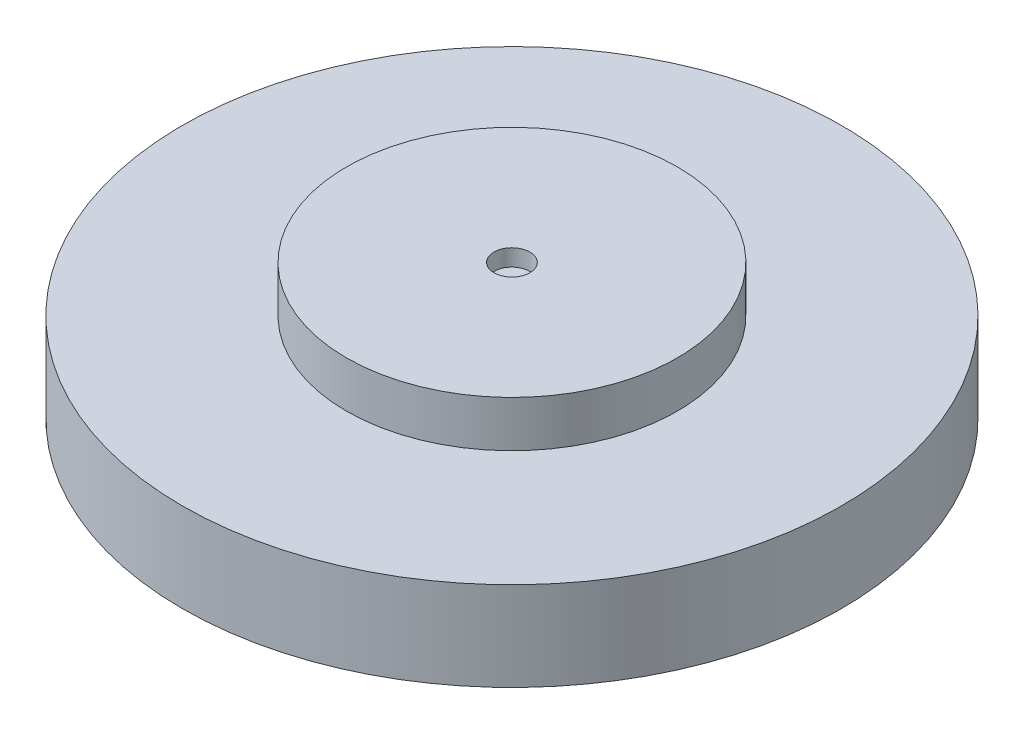
ISO-10303-21;
HEADER;
FILE_DESCRIPTION(('STEP AP214'),'2;1');
FILE_NAME('part.step','',(''),(''),'','','');
FILE_SCHEMA(('AUTOMOTIVE_DESIGN { 1 0 10303 214 1 1 1 1 }'));
ENDSEC;
DATA;
#1=APPLICATION_CONTEXT('core data for automotive mechanical design processes');
#2=APPLICATION_PROTOCOL_DEFINITION('international standard','automotive_design',2000,#1);
#3=PRODUCT_CONTEXT('',#1,'mechanical');
#4=PRODUCT('Part','Part','',(#3));
#5=PRODUCT_RELATED_PRODUCT_CATEGORY('part','',(#4));
#6=PRODUCT_DEFINITION_FORMATION('','',#4);
#7=PRODUCT_DEFINITION_CONTEXT('part definition',#1,'design');
#8=PRODUCT_DEFINITION('design','',#6,#7);
#9=PRODUCT_DEFINITION_SHAPE('','',#8);
#10=(LENGTH_UNIT() NAMED_UNIT(*) SI_UNIT(.MILLI.,.METRE.));
#11=(NAMED_UNIT(*) PLANE_ANGLE_UNIT() SI_UNIT($,.RADIAN.));
#12=(NAMED_UNIT(*) SI_UNIT($,.STERADIAN.) SOLID_ANGLE_UNIT());
#13=UNCERTAINTY_MEASURE_WITH_UNIT(LENGTH_MEASURE(1.E-05),#10,'distance_accuracy_value','');
#14=(GEOMETRIC_REPRESENTATION_CONTEXT(3) GLOBAL_UNCERTAINTY_ASSIGNED_CONTEXT((#13)) GLOBAL_UNIT_ASSIGNED_CONTEXT((#10,
#11,#12)) REPRESENTATION_CONTEXT('',''));
#15=CARTESIAN_POINT('',(0.,0.,0.));
#16=DIRECTION('',(0.,0.,1.));
#17=DIRECTION('',(1.,0.,0.));
#18=AXIS2_PLACEMENT_3D('',#15,#16,#17);
#19=CARTESIAN_POINT('',(0.,13.5,0.));
#20=DIRECTION('',(0.,-1.,0.));
#21=DIRECTION('',(0.,0.,-1.));
#22=AXIS2_PLACEMENT_3D('',#19,#20,#21);
#23=CYLINDRICAL_SURFACE('',#22,50.);
#24=CARTESIAN_POINT('',(0.,13.5,0.));
#25=DIRECTION('',(0.,1.,0.));
#26=DIRECTION('',(0.,0.,1.));
#27=AXIS2_PLACEMENT_3D('',#24,#25,#26);
#28=CIRCLE('',#27,50.);
#29=CARTESIAN_POINT('',(0.,13.5,50.));
#30=VERTEX_POINT('',#29);
#31=EDGE_CURVE('E43',#30,#30,#28,.T.);
#32=ORIENTED_EDGE('',*,*,#31,.F.);
#33=EDGE_LOOP('',(#32));
#34=FACE_BOUND('',#33,.T.);
#35=CARTESIAN_POINT('',(0.,0.,0.));
#36=DIRECTION('',(0.,1.,0.));
#37=DIRECTION('',(0.,0.,1.));
#38=AXIS2_PLACEMENT_3D('',#35,#36,#37);
#39=CIRCLE('',#38,50.);
#40=CARTESIAN_POINT('',(0.,0.,50.));
#41=VERTEX_POINT('',#40);
#42=EDGE_CURVE('E39',#41,#41,#39,.T.);
#43=ORIENTED_EDGE('',*,*,#42,.T.);
#44=EDGE_LOOP('',(#43));
#45=FACE_BOUND('',#44,.T.);
#46=ADVANCED_FACE('F36',(#34,#45),#23,.T.);
#47=CARTESIAN_POINT('',(0.,13.5,0.));
#48=DIRECTION('',(0.,1.,0.));
#49=DIRECTION('',(0.,0.,1.));
#50=AXIS2_PLACEMENT_3D('',#47,#48,#49);
#51=PLANE('',#50);
#52=CARTESIAN_POINT('',(0.,13.5,0.));
#53=DIRECTION('',(0.,1.,0.));
#54=DIRECTION('',(0.,0.,1.));
#55=AXIS2_PLACEMENT_3D('',#52,#53,#54);
#56=CIRCLE('',#55,25.1);
#57=CARTESIAN_POINT('',(0.,13.5,25.1));
#58=VERTEX_POINT('',#57);
#59=EDGE_CURVE('E10',#58,#58,#56,.T.);
#60=ORIENTED_EDGE('',*,*,#59,.F.);
#61=EDGE_LOOP('',(#60));
#62=FACE_BOUND('',#61,.T.);
#63=ORIENTED_EDGE('',*,*,#31,.T.);
#64=EDGE_LOOP('',(#63));
#65=FACE_BOUND('',#64,.T.);
#66=ADVANCED_FACE('F81',(#62,#65),#51,.T.);
#67=CARTESIAN_POINT('',(0.,0.,0.));
#68=DIRECTION('',(0.,1.,0.));
#69=DIRECTION('',(0.,0.,1.));
#70=AXIS2_PLACEMENT_3D('',#67,#68,#69);
#71=PLANE('',#70);
#72=ORIENTED_EDGE('',*,*,#42,.F.);
#73=EDGE_LOOP('',(#72));
#74=FACE_BOUND('',#73,.T.);
#75=ADVANCED_FACE('F75',(#74),#71,.F.);
#76=CARTESIAN_POINT('',(0.,20.5,0.));
#77=DIRECTION('',(0.,-1.,0.));
#78=DIRECTION('',(0.,0.,-1.));
#79=AXIS2_PLACEMENT_3D('',#76,#77,#78);
#80=CYLINDRICAL_SURFACE('',#79,25.1);
#81=CARTESIAN_POINT('',(0.,20.5,0.));
#82=DIRECTION('',(0.,1.,0.));
#83=DIRECTION('',(0.,0.,1.));
#84=AXIS2_PLACEMENT_3D('',#81,#82,#83);
#85=CIRCLE('',#84,25.1);
#86=CARTESIAN_POINT('',(0.,20.5,25.1));
#87=VERTEX_POINT('',#86);
#88=EDGE_CURVE('E49',#87,#87,#85,.T.);
#89=ORIENTED_EDGE('',*,*,#88,.F.);
#90=EDGE_LOOP('',(#89));
#91=FACE_BOUND('',#90,.T.);
#92=ORIENTED_EDGE('',*,*,#59,.T.);
#93=EDGE_LOOP('',(#92));
#94=FACE_BOUND('',#93,.T.);
#95=ADVANCED_FACE('F70',(#91,#94),#80,.T.);
#96=CARTESIAN_POINT('',(0.,20.5,0.));
#97=DIRECTION('',(0.,1.,0.));
#98=DIRECTION('',(0.,0.,1.));
#99=AXIS2_PLACEMENT_3D('',#96,#97,#98);
#100=PLANE('',#99);
#101=CARTESIAN_POINT('',(0.,20.5,0.));
#102=DIRECTION('',(0.,1.,0.));
#103=DIRECTION('',(0.,0.,1.));
#104=AXIS2_PLACEMENT_3D('',#101,#102,#103);
#105=CIRCLE('',#104,2.725);
#106=CARTESIAN_POINT('',(0.,20.5,2.725));
#107=VERTEX_POINT('',#106);
#108=EDGE_CURVE('E53',#107,#107,#105,.T.);
#109=ORIENTED_EDGE('',*,*,#108,.F.);
#110=EDGE_LOOP('',(#109));
#111=FACE_BOUND('',#110,.T.);
#112=ORIENTED_EDGE('',*,*,#88,.T.);
#113=EDGE_LOOP('',(#112));
#114=FACE_BOUND('',#113,.T.);
#115=ADVANCED_FACE('F64',(#111,#114),#100,.T.);
#116=CARTESIAN_POINT('',(0.,17.95,0.));
#117=DIRECTION('',(0.,1.,0.));
#118=DIRECTION('',(0.,0.,1.));
#119=AXIS2_PLACEMENT_3D('',#116,#117,#118);
#120=CYLINDRICAL_SURFACE('',#119,2.725);
#121=CARTESIAN_POINT('',(0.,17.95,0.));
#122=DIRECTION('',(0.,1.,0.));
#123=DIRECTION('',(0.,0.,1.));
#124=AXIS2_PLACEMENT_3D('',#121,#122,#123);
#125=CIRCLE('',#124,2.725);
#126=CARTESIAN_POINT('',(0.,17.95,2.725));
#127=VERTEX_POINT('',#126);
#128=EDGE_CURVE('E52',#127,#127,#125,.T.);
#129=ORIENTED_EDGE('',*,*,#128,.F.);
#130=EDGE_LOOP('',(#129));
#131=FACE_BOUND('',#130,.T.);
#132=ORIENTED_EDGE('',*,*,#108,.T.);
#133=EDGE_LOOP('',(#132));
#134=FACE_BOUND('',#133,.T.);
#135=ADVANCED_FACE('F61',(#131,#134),#120,.F.);
#136=CARTESIAN_POINT('',(0.,17.95,0.));
#137=DIRECTION('',(0.,1.,0.));
#138=DIRECTION('',(0.,0.,1.));
#139=AXIS2_PLACEMENT_3D('',#136,#137,#138);
#140=PLANE('',#139);
#141=ORIENTED_EDGE('',*,*,#128,.T.);
#142=EDGE_LOOP('',(#141));
#143=FACE_BOUND('',#142,.T.);
#144=ADVANCED_FACE('F59',(#143),#140,.T.);
#145=CLOSED_SHELL('',(#46,#66,#75,#95,#115,#135,#144));
#146=MANIFOLD_SOLID_BREP('B2',#145);
#147=ADVANCED_BREP_SHAPE_REPRESENTATION('',(#18,#146),#14);
#148=SHAPE_DEFINITION_REPRESENTATION(#9,#147);
ENDSEC;
END-ISO-10303-21;
